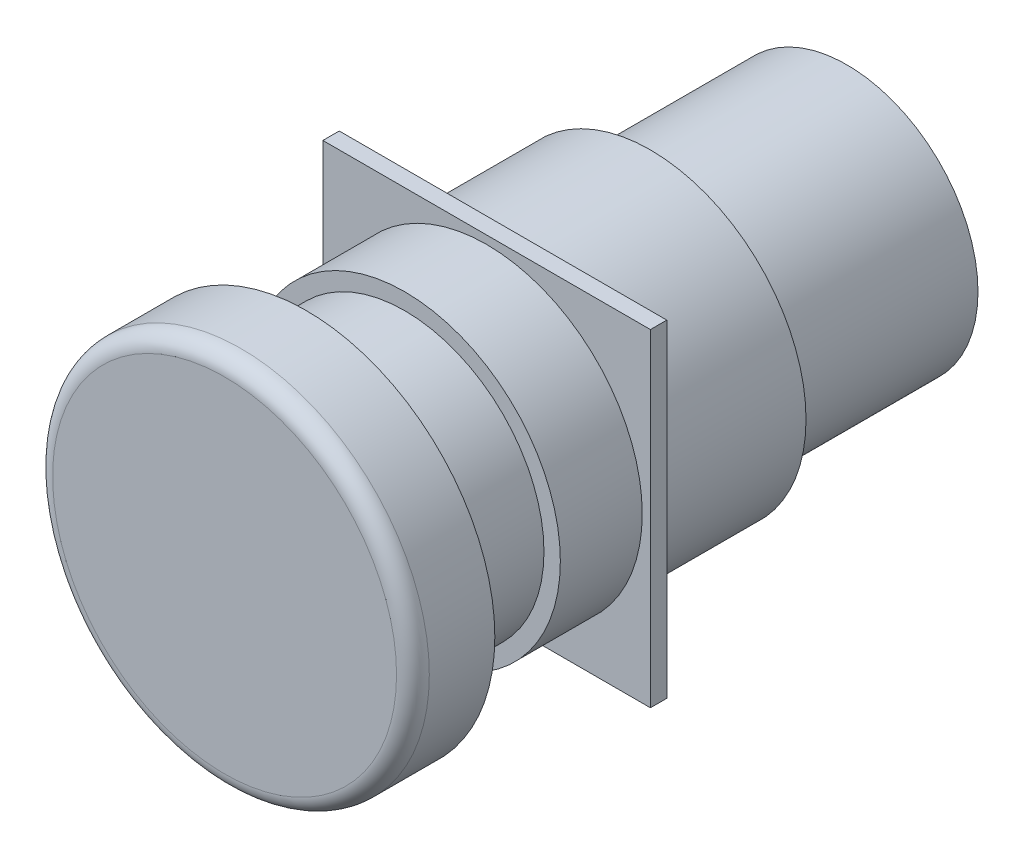
ISO-10303-21;
HEADER;
FILE_DESCRIPTION(('STEP AP214'),'2;1');
FILE_NAME('part.step','',(''),(''),'','','');
FILE_SCHEMA(('AUTOMOTIVE_DESIGN { 1 0 10303 214 1 1 1 1 }'));
ENDSEC;
DATA;
#1=APPLICATION_CONTEXT('core data for automotive mechanical design processes');
#2=APPLICATION_PROTOCOL_DEFINITION('international standard','automotive_design',2000,#1);
#3=PRODUCT_CONTEXT('',#1,'mechanical');
#4=PRODUCT('Part','Part','',(#3));
#5=PRODUCT_RELATED_PRODUCT_CATEGORY('part','',(#4));
#6=PRODUCT_DEFINITION_FORMATION('','',#4);
#7=PRODUCT_DEFINITION_CONTEXT('part definition',#1,'design');
#8=PRODUCT_DEFINITION('design','',#6,#7);
#9=PRODUCT_DEFINITION_SHAPE('','',#8);
#10=(LENGTH_UNIT() NAMED_UNIT(*) SI_UNIT(.MILLI.,.METRE.));
#11=(NAMED_UNIT(*) PLANE_ANGLE_UNIT() SI_UNIT($,.RADIAN.));
#12=(NAMED_UNIT(*) SI_UNIT($,.STERADIAN.) SOLID_ANGLE_UNIT());
#13=UNCERTAINTY_MEASURE_WITH_UNIT(LENGTH_MEASURE(1.E-05),#10,'distance_accuracy_value','');
#14=(GEOMETRIC_REPRESENTATION_CONTEXT(3) GLOBAL_UNCERTAINTY_ASSIGNED_CONTEXT((#13)) GLOBAL_UNIT_ASSIGNED_CONTEXT((#10,
#11,#12)) REPRESENTATION_CONTEXT('',''));
#15=CARTESIAN_POINT('',(0.,0.,0.));
#16=DIRECTION('',(0.,0.,1.));
#17=DIRECTION('',(1.,0.,0.));
#18=AXIS2_PLACEMENT_3D('',#15,#16,#17);
#19=CARTESIAN_POINT('',(0.,0.,0.));
#20=DIRECTION('',(0.,0.,1.));
#21=DIRECTION('',(1.,0.,0.));
#22=AXIS2_PLACEMENT_3D('',#19,#20,#21);
#23=CYLINDRICAL_SURFACE('',#22,11.5);
#24=CARTESIAN_POINT('',(0.,0.,4.));
#25=DIRECTION('',(0.,0.,1.));
#26=DIRECTION('',(1.,0.,0.));
#27=AXIS2_PLACEMENT_3D('',#24,#25,#26);
#28=CIRCLE('',#27,11.5);
#29=CARTESIAN_POINT('',(11.5,0.,4.));
#30=VERTEX_POINT('',#29);
#31=EDGE_CURVE('E11',#30,#30,#28,.F.);
#32=ORIENTED_EDGE('',*,*,#31,.T.);
#33=EDGE_LOOP('',(#32));
#34=FACE_BOUND('',#33,.T.);
#35=CARTESIAN_POINT('',(0.,0.,0.));
#36=DIRECTION('',(0.,0.,1.));
#37=DIRECTION('',(1.,0.,0.));
#38=AXIS2_PLACEMENT_3D('',#35,#36,#37);
#39=CIRCLE('',#38,11.5);
#40=CARTESIAN_POINT('',(11.5,0.,0.));
#41=VERTEX_POINT('',#40);
#42=EDGE_CURVE('E133',#41,#41,#39,.T.);
#43=ORIENTED_EDGE('',*,*,#42,.T.);
#44=EDGE_LOOP('',(#43));
#45=FACE_BOUND('',#44,.T.);
#46=ADVANCED_FACE('F39',(#34,#45),#23,.T.);
#47=CARTESIAN_POINT('',(11.5,0.,0.));
#48=DIRECTION('',(0.,0.,-1.));
#49=DIRECTION('',(-1.,0.,0.));
#50=AXIS2_PLACEMENT_3D('',#47,#48,#49);
#51=PLANE('',#50);
#52=CARTESIAN_POINT('',(0.,0.,0.));
#53=DIRECTION('',(0.,0.,-1.));
#54=DIRECTION('',(1.,0.,0.));
#55=AXIS2_PLACEMENT_3D('',#52,#53,#54);
#56=CIRCLE('',#55,10.5);
#57=CARTESIAN_POINT('',(10.5,0.,0.));
#58=VERTEX_POINT('',#57);
#59=EDGE_CURVE('E129',#58,#58,#56,.T.);
#60=ORIENTED_EDGE('',*,*,#59,.F.);
#61=EDGE_LOOP('',(#60));
#62=FACE_BOUND('',#61,.T.);
#63=ORIENTED_EDGE('',*,*,#42,.F.);
#64=EDGE_LOOP('',(#63));
#65=FACE_BOUND('',#64,.T.);
#66=ADVANCED_FACE('F174',(#62,#65),#51,.T.);
#67=CARTESIAN_POINT('',(0.,0.,5.));
#68=DIRECTION('',(0.,0.,1.));
#69=DIRECTION('',(1.,0.,0.));
#70=AXIS2_PLACEMENT_3D('',#67,#68,#69);
#71=PLANE('',#70);
#72=CARTESIAN_POINT('',(0.,0.,5.));
#73=DIRECTION('',(0.,0.,1.));
#74=DIRECTION('',(1.,0.,0.));
#75=AXIS2_PLACEMENT_3D('',#72,#73,#74);
#76=CIRCLE('',#75,10.5);
#77=CARTESIAN_POINT('',(10.5,0.,5.));
#78=VERTEX_POINT('',#77);
#79=EDGE_CURVE('E48',#78,#78,#76,.T.);
#80=ORIENTED_EDGE('',*,*,#79,.T.);
#81=EDGE_LOOP('',(#80));
#82=FACE_BOUND('',#81,.T.);
#83=ADVANCED_FACE('F179',(#82),#71,.T.);
#84=CARTESIAN_POINT('',(0.,0.,4.));
#85=DIRECTION('',(0.,0.,-1.));
#86=DIRECTION('',(-1.,0.,0.));
#87=AXIS2_PLACEMENT_3D('',#84,#85,#86);
#88=CYLINDRICAL_SURFACE('',#87,10.5);
#89=CARTESIAN_POINT('',(0.,0.,4.));
#90=DIRECTION('',(0.,0.,-1.));
#91=DIRECTION('',(1.,0.,0.));
#92=AXIS2_PLACEMENT_3D('',#89,#90,#91);
#93=CIRCLE('',#92,10.5);
#94=CARTESIAN_POINT('',(10.5,0.,4.));
#95=VERTEX_POINT('',#94);
#96=EDGE_CURVE('E130',#95,#95,#93,.T.);
#97=ORIENTED_EDGE('',*,*,#96,.F.);
#98=EDGE_LOOP('',(#97));
#99=FACE_BOUND('',#98,.T.);
#100=ORIENTED_EDGE('',*,*,#59,.T.);
#101=EDGE_LOOP('',(#100));
#102=FACE_BOUND('',#101,.T.);
#103=ADVANCED_FACE('F186',(#99,#102),#88,.F.);
#104=CARTESIAN_POINT('',(0.,0.,4.));
#105=DIRECTION('',(0.,0.,1.));
#106=DIRECTION('',(1.,0.,0.));
#107=AXIS2_PLACEMENT_3D('',#104,#105,#106);
#108=PLANE('',#107);
#109=CARTESIAN_POINT('',(0.,0.,4.));
#110=DIRECTION('',(0.,0.,1.));
#111=DIRECTION('',(1.,0.,0.));
#112=AXIS2_PLACEMENT_3D('',#109,#110,#111);
#113=CIRCLE('',#112,8.5);
#114=CARTESIAN_POINT('',(8.5,0.,4.));
#115=VERTEX_POINT('',#114);
#116=EDGE_CURVE('E138',#115,#115,#113,.F.);
#117=ORIENTED_EDGE('',*,*,#116,.F.);
#118=EDGE_LOOP('',(#117));
#119=FACE_BOUND('',#118,.T.);
#120=ORIENTED_EDGE('',*,*,#96,.T.);
#121=EDGE_LOOP('',(#120));
#122=FACE_BOUND('',#121,.T.);
#123=ADVANCED_FACE('F189',(#119,#122),#108,.F.);
#124=CARTESIAN_POINT('',(0.,0.,-6.));
#125=DIRECTION('',(0.,0.,1.));
#126=DIRECTION('',(1.,0.,0.));
#127=AXIS2_PLACEMENT_3D('',#124,#125,#126);
#128=CYLINDRICAL_SURFACE('',#127,8.5);
#129=CARTESIAN_POINT('',(0.,0.,-6.));
#130=DIRECTION('',(0.,0.,-1.));
#131=DIRECTION('',(-1.,0.,0.));
#132=AXIS2_PLACEMENT_3D('',#129,#130,#131);
#133=CIRCLE('',#132,8.5);
#134=CARTESIAN_POINT('',(-8.5,0.,-6.));
#135=VERTEX_POINT('',#134);
#136=EDGE_CURVE('E126',#135,#135,#133,.T.);
#137=ORIENTED_EDGE('',*,*,#136,.F.);
#138=EDGE_LOOP('',(#137));
#139=FACE_BOUND('',#138,.T.);
#140=ORIENTED_EDGE('',*,*,#116,.T.);
#141=EDGE_LOOP('',(#140));
#142=FACE_BOUND('',#141,.T.);
#143=ADVANCED_FACE('F193',(#139,#142),#128,.T.);
#144=CARTESIAN_POINT('',(0.,0.,-11.));
#145=DIRECTION('',(0.,0.,1.));
#146=DIRECTION('',(1.,0.,0.));
#147=AXIS2_PLACEMENT_3D('',#144,#145,#146);
#148=CYLINDRICAL_SURFACE('',#147,9.5);
#149=CARTESIAN_POINT('',(0.,0.,-11.));
#150=DIRECTION('',(0.,0.,1.));
#151=DIRECTION('',(-1.,0.,0.));
#152=AXIS2_PLACEMENT_3D('',#149,#150,#151);
#153=CIRCLE('',#152,9.5);
#154=CARTESIAN_POINT('',(-9.5,0.,-11.));
#155=VERTEX_POINT('',#154);
#156=EDGE_CURVE('E118',#155,#155,#153,.T.);
#157=ORIENTED_EDGE('',*,*,#156,.T.);
#158=EDGE_LOOP('',(#157));
#159=FACE_BOUND('',#158,.T.);
#160=CARTESIAN_POINT('',(0.,0.,-6.));
#161=DIRECTION('',(0.,0.,1.));
#162=DIRECTION('',(-1.,0.,0.));
#163=AXIS2_PLACEMENT_3D('',#160,#161,#162);
#164=CIRCLE('',#163,9.5);
#165=CARTESIAN_POINT('',(-9.5,0.,-6.));
#166=VERTEX_POINT('',#165);
#167=EDGE_CURVE('E123',#166,#166,#164,.T.);
#168=ORIENTED_EDGE('',*,*,#167,.F.);
#169=EDGE_LOOP('',(#168));
#170=FACE_BOUND('',#169,.T.);
#171=ADVANCED_FACE('F197',(#159,#170),#148,.T.);
#172=CARTESIAN_POINT('',(0.,0.,-6.));
#173=DIRECTION('',(0.,0.,-1.));
#174=DIRECTION('',(-1.,0.,0.));
#175=AXIS2_PLACEMENT_3D('',#172,#173,#174);
#176=PLANE('',#175);
#177=ORIENTED_EDGE('',*,*,#136,.T.);
#178=EDGE_LOOP('',(#177));
#179=FACE_BOUND('',#178,.T.);
#180=ORIENTED_EDGE('',*,*,#167,.T.);
#181=EDGE_LOOP('',(#180));
#182=FACE_BOUND('',#181,.T.);
#183=ADVANCED_FACE('F201',(#179,#182),#176,.F.);
#184=CARTESIAN_POINT('',(-10.,-10.,-12.));
#185=DIRECTION('',(0.,-1.,0.));
#186=DIRECTION('',(0.,0.,-1.));
#187=AXIS2_PLACEMENT_3D('',#184,#185,#186);
#188=PLANE('',#187);
#189=DIRECTION('',(1.,0.,0.));
#190=VECTOR('',#189,1.);
#191=CARTESIAN_POINT('',(-10.,-10.,-11.));
#192=LINE('',#191,#190);
#193=CARTESIAN_POINT('',(-10.,-10.,-11.));
#194=VERTEX_POINT('',#193);
#195=CARTESIAN_POINT('',(10.,-10.,-11.));
#196=VERTEX_POINT('',#195);
#197=EDGE_CURVE('E108',#194,#196,#192,.T.);
#198=ORIENTED_EDGE('',*,*,#197,.F.);
#199=DIRECTION('',(0.,0.,1.));
#200=VECTOR('',#199,1.);
#201=CARTESIAN_POINT('',(-10.,-10.,-12.));
#202=LINE('',#201,#200);
#203=CARTESIAN_POINT('',(-10.,-10.,-12.));
#204=VERTEX_POINT('',#203);
#205=EDGE_CURVE('E56',#204,#194,#202,.T.);
#206=ORIENTED_EDGE('',*,*,#205,.F.);
#207=DIRECTION('',(1.,0.,0.));
#208=VECTOR('',#207,1.);
#209=CARTESIAN_POINT('',(-10.,-10.,-12.));
#210=LINE('',#209,#208);
#211=CARTESIAN_POINT('',(10.,-10.,-12.));
#212=VERTEX_POINT('',#211);
#213=EDGE_CURVE('E101',#204,#212,#210,.T.);
#214=ORIENTED_EDGE('',*,*,#213,.T.);
#215=DIRECTION('',(0.,0.,1.));
#216=VECTOR('',#215,1.);
#217=CARTESIAN_POINT('',(10.,-10.,-12.));
#218=LINE('',#217,#216);
#219=EDGE_CURVE('E84',#212,#196,#218,.T.);
#220=ORIENTED_EDGE('',*,*,#219,.T.);
#221=EDGE_LOOP('',(#198,#206,#214,#220));
#222=FACE_BOUND('',#221,.T.);
#223=ADVANCED_FACE('F205',(#222),#188,.T.);
#224=CARTESIAN_POINT('',(-10.,10.,-12.));
#225=DIRECTION('',(-1.,0.,0.));
#226=DIRECTION('',(0.,0.,1.));
#227=AXIS2_PLACEMENT_3D('',#224,#225,#226);
#228=PLANE('',#227);
#229=DIRECTION('',(0.,-1.,0.));
#230=VECTOR('',#229,1.);
#231=CARTESIAN_POINT('',(-10.,10.,-11.));
#232=LINE('',#231,#230);
#233=CARTESIAN_POINT('',(-10.,10.,-11.));
#234=VERTEX_POINT('',#233);
#235=EDGE_CURVE('E103',#234,#194,#232,.T.);
#236=ORIENTED_EDGE('',*,*,#235,.F.);
#237=DIRECTION('',(0.,0.,1.));
#238=VECTOR('',#237,1.);
#239=CARTESIAN_POINT('',(-10.,10.,-12.));
#240=LINE('',#239,#238);
#241=CARTESIAN_POINT('',(-10.,10.,-12.));
#242=VERTEX_POINT('',#241);
#243=EDGE_CURVE('E73',#242,#234,#240,.T.);
#244=ORIENTED_EDGE('',*,*,#243,.F.);
#245=DIRECTION('',(0.,-1.,0.));
#246=VECTOR('',#245,1.);
#247=CARTESIAN_POINT('',(-10.,10.,-12.));
#248=LINE('',#247,#246);
#249=EDGE_CURVE('E98',#242,#204,#248,.T.);
#250=ORIENTED_EDGE('',*,*,#249,.T.);
#251=ORIENTED_EDGE('',*,*,#205,.T.);
#252=EDGE_LOOP('',(#236,#244,#250,#251));
#253=FACE_BOUND('',#252,.T.);
#254=ADVANCED_FACE('F209',(#253),#228,.T.);
#255=CARTESIAN_POINT('',(10.,10.,-12.));
#256=DIRECTION('',(0.,1.,0.));
#257=DIRECTION('',(0.,0.,1.));
#258=AXIS2_PLACEMENT_3D('',#255,#256,#257);
#259=PLANE('',#258);
#260=DIRECTION('',(-1.,0.,0.));
#261=VECTOR('',#260,1.);
#262=CARTESIAN_POINT('',(10.,10.,-11.));
#263=LINE('',#262,#261);
#264=CARTESIAN_POINT('',(10.,10.,-11.));
#265=VERTEX_POINT('',#264);
#266=EDGE_CURVE('E92',#265,#234,#263,.T.);
#267=ORIENTED_EDGE('',*,*,#266,.F.);
#268=DIRECTION('',(0.,0.,1.));
#269=VECTOR('',#268,1.);
#270=CARTESIAN_POINT('',(10.,10.,-12.));
#271=LINE('',#270,#269);
#272=CARTESIAN_POINT('',(10.,10.,-12.));
#273=VERTEX_POINT('',#272);
#274=EDGE_CURVE('E87',#273,#265,#271,.T.);
#275=ORIENTED_EDGE('',*,*,#274,.F.);
#276=DIRECTION('',(-1.,0.,0.));
#277=VECTOR('',#276,1.);
#278=CARTESIAN_POINT('',(10.,10.,-12.));
#279=LINE('',#278,#277);
#280=EDGE_CURVE('E90',#273,#242,#279,.T.);
#281=ORIENTED_EDGE('',*,*,#280,.T.);
#282=ORIENTED_EDGE('',*,*,#243,.T.);
#283=EDGE_LOOP('',(#267,#275,#281,#282));
#284=FACE_BOUND('',#283,.T.);
#285=ADVANCED_FACE('F89',(#284),#259,.T.);
#286=CARTESIAN_POINT('',(10.,-10.,-12.));
#287=DIRECTION('',(1.,0.,0.));
#288=DIRECTION('',(0.,0.,-1.));
#289=AXIS2_PLACEMENT_3D('',#286,#287,#288);
#290=PLANE('',#289);
#291=DIRECTION('',(0.,1.,0.));
#292=VECTOR('',#291,1.);
#293=CARTESIAN_POINT('',(10.,-10.,-11.));
#294=LINE('',#293,#292);
#295=EDGE_CURVE('E111',#196,#265,#294,.T.);
#296=ORIENTED_EDGE('',*,*,#295,.F.);
#297=ORIENTED_EDGE('',*,*,#219,.F.);
#298=DIRECTION('',(0.,1.,0.));
#299=VECTOR('',#298,1.);
#300=CARTESIAN_POINT('',(10.,-10.,-12.));
#301=LINE('',#300,#299);
#302=EDGE_CURVE('E97',#212,#273,#301,.T.);
#303=ORIENTED_EDGE('',*,*,#302,.T.);
#304=ORIENTED_EDGE('',*,*,#274,.T.);
#305=EDGE_LOOP('',(#296,#297,#303,#304));
#306=FACE_BOUND('',#305,.T.);
#307=ADVANCED_FACE('F100',(#306),#290,.T.);
#308=CARTESIAN_POINT('',(0.,0.,-12.));
#309=DIRECTION('',(0.,0.,1.));
#310=DIRECTION('',(1.,0.,0.));
#311=AXIS2_PLACEMENT_3D('',#308,#309,#310);
#312=PLANE('',#311);
#313=CARTESIAN_POINT('',(0.,0.,-12.));
#314=DIRECTION('',(0.,0.,-1.));
#315=DIRECTION('',(-1.,0.,0.));
#316=AXIS2_PLACEMENT_3D('',#313,#314,#315);
#317=CIRCLE('',#316,9.5);
#318=CARTESIAN_POINT('',(-9.5,0.,-12.));
#319=VERTEX_POINT('',#318);
#320=EDGE_CURVE('E140',#319,#319,#317,.T.);
#321=ORIENTED_EDGE('',*,*,#320,.F.);
#322=EDGE_LOOP('',(#321));
#323=FACE_BOUND('',#322,.T.);
#324=ORIENTED_EDGE('',*,*,#213,.F.);
#325=ORIENTED_EDGE('',*,*,#249,.F.);
#326=ORIENTED_EDGE('',*,*,#280,.F.);
#327=ORIENTED_EDGE('',*,*,#302,.F.);
#328=EDGE_LOOP('',(#324,#325,#326,#327));
#329=FACE_BOUND('',#328,.T.);
#330=ADVANCED_FACE('F96',(#323,#329),#312,.F.);
#331=CARTESIAN_POINT('',(0.,0.,-11.));
#332=DIRECTION('',(0.,0.,1.));
#333=DIRECTION('',(1.,0.,0.));
#334=AXIS2_PLACEMENT_3D('',#331,#332,#333);
#335=PLANE('',#334);
#336=ORIENTED_EDGE('',*,*,#156,.F.);
#337=EDGE_LOOP('',(#336));
#338=FACE_BOUND('',#337,.T.);
#339=ORIENTED_EDGE('',*,*,#197,.T.);
#340=ORIENTED_EDGE('',*,*,#295,.T.);
#341=ORIENTED_EDGE('',*,*,#266,.T.);
#342=ORIENTED_EDGE('',*,*,#235,.T.);
#343=EDGE_LOOP('',(#339,#340,#341,#342));
#344=FACE_BOUND('',#343,.T.);
#345=ADVANCED_FACE('F216',(#338,#344),#335,.T.);
#346=CARTESIAN_POINT('',(0.,0.,-21.));
#347=DIRECTION('',(0.,0.,1.));
#348=DIRECTION('',(1.,0.,0.));
#349=AXIS2_PLACEMENT_3D('',#346,#347,#348);
#350=CYLINDRICAL_SURFACE('',#349,9.5);
#351=CARTESIAN_POINT('',(0.,0.,-21.));
#352=DIRECTION('',(0.,0.,-1.));
#353=DIRECTION('',(-1.,0.,0.));
#354=AXIS2_PLACEMENT_3D('',#351,#352,#353);
#355=CIRCLE('',#354,9.5);
#356=CARTESIAN_POINT('',(-9.5,0.,-21.));
#357=VERTEX_POINT('',#356);
#358=EDGE_CURVE('E112',#357,#357,#355,.T.);
#359=ORIENTED_EDGE('',*,*,#358,.F.);
#360=EDGE_LOOP('',(#359));
#361=FACE_BOUND('',#360,.T.);
#362=ORIENTED_EDGE('',*,*,#320,.T.);
#363=EDGE_LOOP('',(#362));
#364=FACE_BOUND('',#363,.T.);
#365=ADVANCED_FACE('F170',(#361,#364),#350,.T.);
#366=CARTESIAN_POINT('',(0.,0.,-21.));
#367=DIRECTION('',(0.,0.,-1.));
#368=DIRECTION('',(-1.,0.,0.));
#369=AXIS2_PLACEMENT_3D('',#366,#367,#368);
#370=PLANE('',#369);
#371=CARTESIAN_POINT('',(0.,0.,-21.));
#372=DIRECTION('',(0.,0.,-1.));
#373=DIRECTION('',(-1.,0.,0.));
#374=AXIS2_PLACEMENT_3D('',#371,#372,#373);
#375=CIRCLE('',#374,8.);
#376=CARTESIAN_POINT('',(-8.,0.,-21.));
#377=VERTEX_POINT('',#376);
#378=EDGE_CURVE('E142',#377,#377,#375,.T.);
#379=ORIENTED_EDGE('',*,*,#378,.F.);
#380=EDGE_LOOP('',(#379));
#381=FACE_BOUND('',#380,.T.);
#382=ORIENTED_EDGE('',*,*,#358,.T.);
#383=EDGE_LOOP('',(#382));
#384=FACE_BOUND('',#383,.T.);
#385=ADVANCED_FACE('F163',(#381,#384),#370,.T.);
#386=CARTESIAN_POINT('',(0.,0.,-33.));
#387=DIRECTION('',(0.,0.,1.));
#388=DIRECTION('',(1.,0.,0.));
#389=AXIS2_PLACEMENT_3D('',#386,#387,#388);
#390=CYLINDRICAL_SURFACE('',#389,8.);
#391=CARTESIAN_POINT('',(0.,0.,-33.));
#392=DIRECTION('',(0.,0.,-1.));
#393=DIRECTION('',(-1.,0.,0.));
#394=AXIS2_PLACEMENT_3D('',#391,#392,#393);
#395=CIRCLE('',#394,8.);
#396=CARTESIAN_POINT('',(-8.,0.,-33.));
#397=VERTEX_POINT('',#396);
#398=EDGE_CURVE('E152',#397,#397,#395,.T.);
#399=ORIENTED_EDGE('',*,*,#398,.F.);
#400=EDGE_LOOP('',(#399));
#401=FACE_BOUND('',#400,.T.);
#402=ORIENTED_EDGE('',*,*,#378,.T.);
#403=EDGE_LOOP('',(#402));
#404=FACE_BOUND('',#403,.T.);
#405=ADVANCED_FACE('F161',(#401,#404),#390,.T.);
#406=CARTESIAN_POINT('',(0.,0.,-33.));
#407=DIRECTION('',(0.,0.,-1.));
#408=DIRECTION('',(-1.,0.,0.));
#409=AXIS2_PLACEMENT_3D('',#406,#407,#408);
#410=PLANE('',#409);
#411=ORIENTED_EDGE('',*,*,#398,.T.);
#412=EDGE_LOOP('',(#411));
#413=FACE_BOUND('',#412,.T.);
#414=ADVANCED_FACE('F159',(#413),#410,.T.);
#415=CARTESIAN_POINT('',(0.,0.,4.));
#416=DIRECTION('',(0.,0.,1.));
#417=DIRECTION('',(1.,0.,0.));
#418=AXIS2_PLACEMENT_3D('',#415,#416,#417);
#419=TOROIDAL_SURFACE('',#418,10.5,1.);
#420=ORIENTED_EDGE('',*,*,#31,.F.);
#421=EDGE_LOOP('',(#420));
#422=FACE_BOUND('',#421,.T.);
#423=ORIENTED_EDGE('',*,*,#79,.F.);
#424=EDGE_LOOP('',(#423));
#425=FACE_BOUND('',#424,.T.);
#426=ADVANCED_FACE('F41',(#422,#425),#419,.T.);
#427=CLOSED_SHELL('',(#46,#66,#83,#103,#123,#143,#171,#183,#223,#254,#285,#307,#330,#345,#365,
#385,#405,#414,#426));
#428=MANIFOLD_SOLID_BREP('B2',#427);
#429=ADVANCED_BREP_SHAPE_REPRESENTATION('',(#18,#428),#14);
#430=SHAPE_DEFINITION_REPRESENTATION(#9,#429);
ENDSEC;
END-ISO-10303-21;
